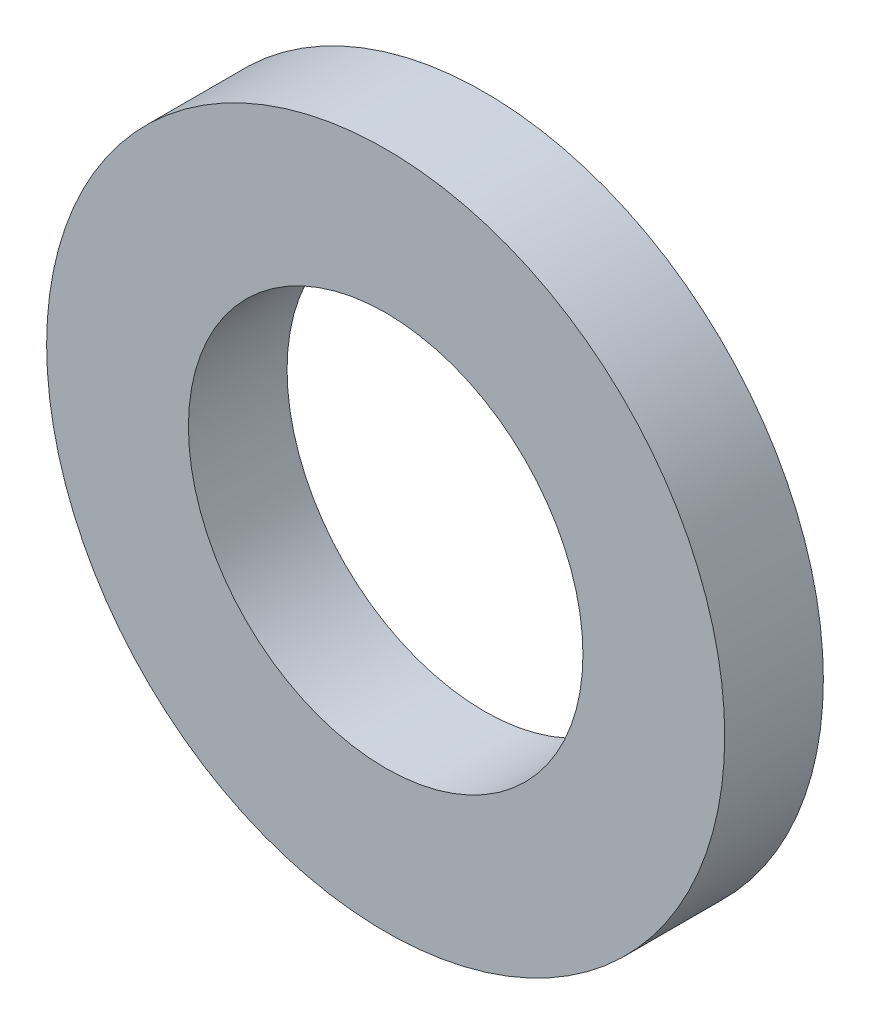
ISO-10303-21;
HEADER;
FILE_DESCRIPTION(('STEP AP214'),'2;1');
FILE_NAME('part.step','',(''),(''),'','','');
FILE_SCHEMA(('AUTOMOTIVE_DESIGN { 1 0 10303 214 1 1 1 1 }'));
ENDSEC;
DATA;
#1=APPLICATION_CONTEXT('core data for automotive mechanical design processes');
#2=APPLICATION_PROTOCOL_DEFINITION('international standard','automotive_design',2000,#1);
#3=PRODUCT_CONTEXT('',#1,'mechanical');
#4=PRODUCT('Part','Part','',(#3));
#5=PRODUCT_RELATED_PRODUCT_CATEGORY('part','',(#4));
#6=PRODUCT_DEFINITION_FORMATION('','',#4);
#7=PRODUCT_DEFINITION_CONTEXT('part definition',#1,'design');
#8=PRODUCT_DEFINITION('design','',#6,#7);
#9=PRODUCT_DEFINITION_SHAPE('','',#8);
#10=(LENGTH_UNIT() NAMED_UNIT(*) SI_UNIT(.MILLI.,.METRE.));
#11=(NAMED_UNIT(*) PLANE_ANGLE_UNIT() SI_UNIT($,.RADIAN.));
#12=(NAMED_UNIT(*) SI_UNIT($,.STERADIAN.) SOLID_ANGLE_UNIT());
#13=UNCERTAINTY_MEASURE_WITH_UNIT(LENGTH_MEASURE(1.E-05),#10,'distance_accuracy_value','');
#14=(GEOMETRIC_REPRESENTATION_CONTEXT(3) GLOBAL_UNCERTAINTY_ASSIGNED_CONTEXT((#13)) GLOBAL_UNIT_ASSIGNED_CONTEXT((#10,
#11,#12)) REPRESENTATION_CONTEXT('',''));
#15=CARTESIAN_POINT('',(0.,0.,0.));
#16=DIRECTION('',(0.,0.,1.));
#17=DIRECTION('',(1.,0.,0.));
#18=AXIS2_PLACEMENT_3D('',#15,#16,#17);
#19=CARTESIAN_POINT('',(0.,0.,1.60000007599592));
#20=DIRECTION('',(0.,0.,-1.));
#21=DIRECTION('',(-1.,0.,0.));
#22=AXIS2_PLACEMENT_3D('',#19,#20,#21);
#23=CYLINDRICAL_SURFACE('',#22,5.49999997019768);
#24=CARTESIAN_POINT('',(0.,0.,1.60000007599592));
#25=DIRECTION('',(0.,0.,1.));
#26=DIRECTION('',(1.,0.,0.));
#27=AXIS2_PLACEMENT_3D('',#24,#25,#26);
#28=CIRCLE('',#27,5.49999997019768);
#29=CARTESIAN_POINT('',(-5.49999997019768,0.,1.60000007599592));
#30=VERTEX_POINT('',#29);
#31=EDGE_CURVE('E10',#30,#30,#28,.T.);
#32=CARTESIAN_POINT('',(0.,0.,0.));
#33=DIRECTION('',(0.,0.,1.));
#34=DIRECTION('',(1.,0.,0.));
#35=AXIS2_PLACEMENT_3D('',#32,#33,#34);
#36=CIRCLE('',#35,5.49999997019768);
#37=CARTESIAN_POINT('',(-5.49999997019768,0.,0.));
#38=VERTEX_POINT('',#37);
#39=EDGE_CURVE('E36',#38,#38,#36,.T.);
#40=CARTESIAN_POINT('',(-5.49999997019768,0.,1.60000007599592));
#41=CARTESIAN_POINT('',(-5.49999997019768,0.,1.58333340853763));
#42=CARTESIAN_POINT('',(-5.49999997019768,0.,1.56666674107934));
#43=CARTESIAN_POINT('',(-5.49999997019768,0.,1.53333340616276));
#44=CARTESIAN_POINT('',(-5.49999997019768,0.,1.51666673870447));
#45=CARTESIAN_POINT('',(-5.49999997019768,0.,1.48333340378789));
#46=CARTESIAN_POINT('',(-5.49999997019768,0.,1.4666667363296));
#47=CARTESIAN_POINT('',(-5.49999997019768,0.,1.43333340141301));
#48=CARTESIAN_POINT('',(-5.49999997019768,0.,1.41666673395472));
#49=CARTESIAN_POINT('',(-5.49999997019768,0.,1.38333339903814));
#50=CARTESIAN_POINT('',(-5.49999997019768,0.,1.36666673157985));
#51=CARTESIAN_POINT('',(-5.49999997019768,0.,1.33333339666327));
#52=CARTESIAN_POINT('',(-5.49999997019768,0.,1.31666672920498));
#53=CARTESIAN_POINT('',(-5.49999997019768,0.,1.2833333942884));
#54=CARTESIAN_POINT('',(-5.49999997019768,0.,1.26666672683011));
#55=CARTESIAN_POINT('',(-5.49999997019768,0.,1.23333339191352));
#56=CARTESIAN_POINT('',(-5.49999997019768,0.,1.21666672445523));
#57=CARTESIAN_POINT('',(-5.49999997019768,0.,1.18333338953865));
#58=CARTESIAN_POINT('',(-5.49999997019768,0.,1.16666672208036));
#59=CARTESIAN_POINT('',(-5.49999997019768,0.,1.13333338716378));
#60=CARTESIAN_POINT('',(-5.49999997019768,0.,1.11666671970549));
#61=CARTESIAN_POINT('',(-5.49999997019768,0.,1.08333338478891));
#62=CARTESIAN_POINT('',(-5.49999997019768,0.,1.06666671733061));
#63=CARTESIAN_POINT('',(-5.49999997019768,0.,1.03333338241403));
#64=CARTESIAN_POINT('',(-5.49999997019768,0.,1.01666671495574));
#65=CARTESIAN_POINT('',(-5.49999997019768,0.,0.98333338003916));
#66=CARTESIAN_POINT('',(-5.49999997019768,0.,0.96666671258087));
#67=CARTESIAN_POINT('',(-5.49999997019768,0.,0.933333377664288));
#68=CARTESIAN_POINT('',(-5.49999997019768,0.,0.916666710205997));
#69=CARTESIAN_POINT('',(-5.49999997019768,0.,0.883333375289415));
#70=CARTESIAN_POINT('',(-5.49999997019768,0.,0.866666707831124));
#71=CARTESIAN_POINT('',(-5.49999997019768,0.,0.833333372914543));
#72=CARTESIAN_POINT('',(-5.49999997019768,0.,0.816666705456252));
#73=CARTESIAN_POINT('',(-5.49999997019768,0.,0.78333337053967));
#74=CARTESIAN_POINT('',(-5.49999997019768,0.,0.766666703081379));
#75=CARTESIAN_POINT('',(-5.49999997019768,0.,0.733333368164798));
#76=CARTESIAN_POINT('',(-5.49999997019768,0.,0.716666700706507));
#77=CARTESIAN_POINT('',(-5.49999997019768,0.,0.683333365789925));
#78=CARTESIAN_POINT('',(-5.49999997019768,0.,0.666666698331634));
#79=CARTESIAN_POINT('',(-5.49999997019768,0.,0.633333363415052));
#80=CARTESIAN_POINT('',(-5.49999997019768,0.,0.616666695956761));
#81=CARTESIAN_POINT('',(-5.49999997019768,0.,0.58333336104018));
#82=CARTESIAN_POINT('',(-5.49999997019768,0.,0.566666693581889));
#83=CARTESIAN_POINT('',(-5.49999997019768,0.,0.533333358665307));
#84=CARTESIAN_POINT('',(-5.49999997019768,0.,0.516666691207016));
#85=CARTESIAN_POINT('',(-5.49999997019768,0.,0.483333356290435));
#86=CARTESIAN_POINT('',(-5.49999997019768,0.,0.466666688832144));
#87=CARTESIAN_POINT('',(-5.49999997019768,0.,0.433333353915562));
#88=CARTESIAN_POINT('',(-5.49999997019768,0.,0.416666686457271));
#89=CARTESIAN_POINT('',(-5.49999997019768,0.,0.383333351540689));
#90=CARTESIAN_POINT('',(-5.49999997019768,0.,0.366666684082399));
#91=CARTESIAN_POINT('',(-5.49999997019768,0.,0.333333349165817));
#92=CARTESIAN_POINT('',(-5.49999997019768,0.,0.316666681707526));
#93=CARTESIAN_POINT('',(-5.49999997019768,0.,0.283333346790944));
#94=CARTESIAN_POINT('',(-5.49999997019768,0.,0.266666679332653));
#95=CARTESIAN_POINT('',(-5.49999997019768,0.,0.233333344416072));
#96=CARTESIAN_POINT('',(-5.49999997019768,0.,0.216666676957781));
#97=CARTESIAN_POINT('',(-5.49999997019768,0.,0.183333342041199));
#98=CARTESIAN_POINT('',(-5.49999997019768,0.,0.166666674582908));
#99=CARTESIAN_POINT('',(-5.49999997019768,0.,0.133333339666327));
#100=CARTESIAN_POINT('',(-5.49999997019768,0.,0.116666672208036));
#101=CARTESIAN_POINT('',(-5.49999997019768,0.,0.0833333372914541));
#102=CARTESIAN_POINT('',(-5.49999997019768,0.,0.0666666698331632));
#103=CARTESIAN_POINT('',(-5.49999997019768,0.,0.0333333349165815));
#104=CARTESIAN_POINT('',(-5.49999997019768,0.,0.0166666674582906));
#105=CARTESIAN_POINT('',(-5.49999997019768,0.,0.));
#106=B_SPLINE_CURVE_WITH_KNOTS('',3,(#40,#41,#42,#43,#44,#45,#46,#47,#48,#49,#50,#51,#52,#53,
#54,#55,#56,#57,#58,#59,#60,#61,#62,#63,#64,#65,#66,#67,#68,#69,#70,#71,#72,#73,#74,#75,#76,#77,
#78,#79,#80,#81,#82,#83,#84,#85,#86,#87,#88,#89,#90,#91,#92,#93,#94,#95,#96,#97,#98,#99,#100,
#101,#102,#103,#104,#105),.UNSPECIFIED.,.F.,.F.,(4,2,2,2,2,2,2,2,2,2,2,2,2,2,2,2,2,2,2,2,2,2,2,
2,2,2,2,2,2,2,2,2,4),(0.,0.0500000023748724,0.100000004749745,0.150000007124617,
0.20000000949949,0.250000011874363,0.300000014249235,0.350000016624108,0.40000001899898,
0.450000021373853,0.500000023748725,0.550000026123598,0.600000028498471,0.650000030873343,
0.700000033248216,0.750000035623088,0.800000037997961,0.850000040372833,0.900000042747706,
0.950000045122579,1.00000004749745,1.05000004987232,1.1000000522472,1.15000005462207,
1.20000005699694,1.25000005937181,1.30000006174669,1.35000006412156,1.40000006649643,
1.4500000688713,1.50000007124618,1.55000007362105,1.60000007599592),.UNSPECIFIED.);
#107=EDGE_CURVE('BSEAM33',#30,#38,#106,.T.);
#108=ORIENTED_EDGE('',*,*,#31,.F.);
#109=ORIENTED_EDGE('',*,*,#39,.T.);
#110=ORIENTED_EDGE('',*,*,#107,.T.);
#111=ORIENTED_EDGE('',*,*,#107,.F.);
#112=EDGE_LOOP('',(#108,#110,#109,#111));
#113=FACE_BOUND('',#112,.T.);
#114=ADVANCED_FACE('F33',(#113),#23,.T.);
#115=CARTESIAN_POINT('',(0.,0.,1.60000007599592));
#116=DIRECTION('',(0.,0.,1.));
#117=DIRECTION('',(1.,0.,0.));
#118=AXIS2_PLACEMENT_3D('',#115,#116,#117);
#119=PLANE('',#118);
#120=CARTESIAN_POINT('',(0.,0.,1.60000007599592));
#121=DIRECTION('',(0.,0.,1.));
#122=DIRECTION('',(1.,0.,0.));
#123=AXIS2_PLACEMENT_3D('',#120,#121,#122);
#124=CIRCLE('',#123,3.20000015199184);
#125=CARTESIAN_POINT('',(3.20000015199184,0.,1.60000007599592));
#126=VERTEX_POINT('',#125);
#127=EDGE_CURVE('E45',#126,#126,#124,.T.);
#128=ORIENTED_EDGE('',*,*,#127,.F.);
#129=EDGE_LOOP('',(#128));
#130=FACE_BOUND('',#129,.T.);
#131=ORIENTED_EDGE('',*,*,#31,.T.);
#132=EDGE_LOOP('',(#131));
#133=FACE_BOUND('',#132,.T.);
#134=ADVANCED_FACE('F60',(#130,#133),#119,.T.);
#135=CARTESIAN_POINT('',(0.,0.,0.));
#136=DIRECTION('',(0.,0.,1.));
#137=DIRECTION('',(1.,0.,0.));
#138=AXIS2_PLACEMENT_3D('',#135,#136,#137);
#139=PLANE('',#138);
#140=CARTESIAN_POINT('',(0.,0.,0.));
#141=DIRECTION('',(0.,0.,1.));
#142=DIRECTION('',(1.,0.,0.));
#143=AXIS2_PLACEMENT_3D('',#140,#141,#142);
#144=CIRCLE('',#143,3.20000015199184);
#145=CARTESIAN_POINT('',(3.20000015199184,0.,0.));
#146=VERTEX_POINT('',#145);
#147=EDGE_CURVE('E43',#146,#146,#144,.T.);
#148=ORIENTED_EDGE('',*,*,#147,.T.);
#149=EDGE_LOOP('',(#148));
#150=FACE_BOUND('',#149,.T.);
#151=ORIENTED_EDGE('',*,*,#39,.F.);
#152=EDGE_LOOP('',(#151));
#153=FACE_BOUND('',#152,.T.);
#154=ADVANCED_FACE('F51',(#150,#153),#139,.F.);
#155=CARTESIAN_POINT('',(0.,0.,0.));
#156=DIRECTION('',(0.,0.,1.));
#157=DIRECTION('',(1.,0.,0.));
#158=AXIS2_PLACEMENT_3D('',#155,#156,#157);
#159=CYLINDRICAL_SURFACE('',#158,3.20000015199184);
#160=CARTESIAN_POINT('',(3.20000015199184,0.,0.));
#161=CARTESIAN_POINT('',(3.20000015199184,0.,0.0166666674582908));
#162=CARTESIAN_POINT('',(3.20000015199184,0.,0.0333333349165817));
#163=CARTESIAN_POINT('',(3.20000015199184,0.,0.0666666698331634));
#164=CARTESIAN_POINT('',(3.20000015199184,0.,0.0833333372914543));
#165=CARTESIAN_POINT('',(3.20000015199184,0.,0.116666672208036));
#166=CARTESIAN_POINT('',(3.20000015199184,0.,0.133333339666327));
#167=CARTESIAN_POINT('',(3.20000015199184,0.,0.166666674582909));
#168=CARTESIAN_POINT('',(3.20000015199184,0.,0.183333342041199));
#169=CARTESIAN_POINT('',(3.20000015199184,0.,0.216666676957781));
#170=CARTESIAN_POINT('',(3.20000015199184,0.,0.233333344416072));
#171=CARTESIAN_POINT('',(3.20000015199184,0.,0.266666679332654));
#172=CARTESIAN_POINT('',(3.20000015199184,0.,0.283333346790944));
#173=CARTESIAN_POINT('',(3.20000015199184,0.,0.316666681707526));
#174=CARTESIAN_POINT('',(3.20000015199184,0.,0.333333349165817));
#175=CARTESIAN_POINT('',(3.20000015199184,0.,0.366666684082399));
#176=CARTESIAN_POINT('',(3.20000015199184,0.,0.38333335154069));
#177=CARTESIAN_POINT('',(3.20000015199184,0.,0.416666686457271));
#178=CARTESIAN_POINT('',(3.20000015199184,0.,0.433333353915562));
#179=CARTESIAN_POINT('',(3.20000015199184,0.,0.466666688832144));
#180=CARTESIAN_POINT('',(3.20000015199184,0.,0.483333356290435));
#181=CARTESIAN_POINT('',(3.20000015199184,0.,0.516666691207016));
#182=CARTESIAN_POINT('',(3.20000015199184,0.,0.533333358665307));
#183=CARTESIAN_POINT('',(3.20000015199184,0.,0.566666693581889));
#184=CARTESIAN_POINT('',(3.20000015199184,0.,0.58333336104018));
#185=CARTESIAN_POINT('',(3.20000015199184,0.,0.616666695956761));
#186=CARTESIAN_POINT('',(3.20000015199184,0.,0.633333363415052));
#187=CARTESIAN_POINT('',(3.20000015199184,0.,0.666666698331634));
#188=CARTESIAN_POINT('',(3.20000015199184,0.,0.683333365789925));
#189=CARTESIAN_POINT('',(3.20000015199184,0.,0.716666700706507));
#190=CARTESIAN_POINT('',(3.20000015199184,0.,0.733333368164798));
#191=CARTESIAN_POINT('',(3.20000015199184,0.,0.766666703081379));
#192=CARTESIAN_POINT('',(3.20000015199184,0.,0.78333337053967));
#193=CARTESIAN_POINT('',(3.20000015199184,0.,0.816666705456252));
#194=CARTESIAN_POINT('',(3.20000015199184,0.,0.833333372914543));
#195=CARTESIAN_POINT('',(3.20000015199184,0.,0.866666707831124));
#196=CARTESIAN_POINT('',(3.20000015199184,0.,0.883333375289415));
#197=CARTESIAN_POINT('',(3.20000015199184,0.,0.916666710205997));
#198=CARTESIAN_POINT('',(3.20000015199184,0.,0.933333377664288));
#199=CARTESIAN_POINT('',(3.20000015199184,0.,0.966666712580869));
#200=CARTESIAN_POINT('',(3.20000015199184,0.,0.98333338003916));
#201=CARTESIAN_POINT('',(3.20000015199184,0.,1.01666671495574));
#202=CARTESIAN_POINT('',(3.20000015199184,0.,1.03333338241403));
#203=CARTESIAN_POINT('',(3.20000015199184,0.,1.06666671733061));
#204=CARTESIAN_POINT('',(3.20000015199184,0.,1.08333338478891));
#205=CARTESIAN_POINT('',(3.20000015199184,0.,1.11666671970549));
#206=CARTESIAN_POINT('',(3.20000015199184,0.,1.13333338716378));
#207=CARTESIAN_POINT('',(3.20000015199184,0.,1.16666672208036));
#208=CARTESIAN_POINT('',(3.20000015199184,0.,1.18333338953865));
#209=CARTESIAN_POINT('',(3.20000015199184,0.,1.21666672445523));
#210=CARTESIAN_POINT('',(3.20000015199184,0.,1.23333339191352));
#211=CARTESIAN_POINT('',(3.20000015199184,0.,1.2666667268301));
#212=CARTESIAN_POINT('',(3.20000015199184,0.,1.2833333942884));
#213=CARTESIAN_POINT('',(3.20000015199184,0.,1.31666672920498));
#214=CARTESIAN_POINT('',(3.20000015199184,0.,1.33333339666327));
#215=CARTESIAN_POINT('',(3.20000015199184,0.,1.36666673157985));
#216=CARTESIAN_POINT('',(3.20000015199184,0.,1.38333339903814));
#217=CARTESIAN_POINT('',(3.20000015199184,0.,1.41666673395472));
#218=CARTESIAN_POINT('',(3.20000015199184,0.,1.43333340141301));
#219=CARTESIAN_POINT('',(3.20000015199184,0.,1.4666667363296));
#220=CARTESIAN_POINT('',(3.20000015199184,0.,1.48333340378789));
#221=CARTESIAN_POINT('',(3.20000015199184,0.,1.51666673870447));
#222=CARTESIAN_POINT('',(3.20000015199184,0.,1.53333340616276));
#223=CARTESIAN_POINT('',(3.20000015199184,0.,1.56666674107934));
#224=CARTESIAN_POINT('',(3.20000015199184,0.,1.58333340853763));
#225=CARTESIAN_POINT('',(3.20000015199184,0.,1.60000007599592));
#226=B_SPLINE_CURVE_WITH_KNOTS('',3,(#160,#161,#162,#163,#164,#165,#166,#167,#168,#169,#170,
#171,#172,#173,#174,#175,#176,#177,#178,#179,#180,#181,#182,#183,#184,#185,#186,#187,#188,#189,
#190,#191,#192,#193,#194,#195,#196,#197,#198,#199,#200,#201,#202,#203,#204,#205,#206,#207,#208,
#209,#210,#211,#212,#213,#214,#215,#216,#217,#218,#219,#220,#221,#222,#223,#224,#225),
.UNSPECIFIED.,.F.,.F.,(4,2,2,2,2,2,2,2,2,2,2,2,2,2,2,2,2,2,2,2,2,2,2,2,2,2,2,2,2,2,2,2,4),(0.,
0.0500000023748726,0.100000004749745,0.150000007124618,0.20000000949949,0.250000011874363,
0.300000014249235,0.350000016624108,0.40000001899898,0.450000021373853,0.500000023748726,
0.550000026123598,0.600000028498471,0.650000030873343,0.700000033248216,0.750000035623088,
0.800000037997961,0.850000040372833,0.900000042747706,0.950000045122579,1.00000004749745,
1.05000004987232,1.1000000522472,1.15000005462207,1.20000005699694,1.25000005937181,
1.30000006174669,1.35000006412156,1.40000006649643,1.4500000688713,1.50000007124618,
1.55000007362105,1.60000007599592),.UNSPECIFIED.);
#227=EDGE_CURVE('BSEAM54',#146,#126,#226,.T.);
#228=ORIENTED_EDGE('',*,*,#147,.F.);
#229=ORIENTED_EDGE('',*,*,#127,.T.);
#230=ORIENTED_EDGE('',*,*,#227,.T.);
#231=ORIENTED_EDGE('',*,*,#227,.F.);
#232=EDGE_LOOP('',(#228,#230,#229,#231));
#233=FACE_BOUND('',#232,.T.);
#234=ADVANCED_FACE('F54',(#233),#159,.F.);
#235=CLOSED_SHELL('',(#114,#134,#154,#234));
#236=MANIFOLD_SOLID_BREP('B2',#235);
#237=ADVANCED_BREP_SHAPE_REPRESENTATION('',(#18,#236),#14);
#238=SHAPE_DEFINITION_REPRESENTATION(#9,#237);
ENDSEC;
END-ISO-10303-21;
